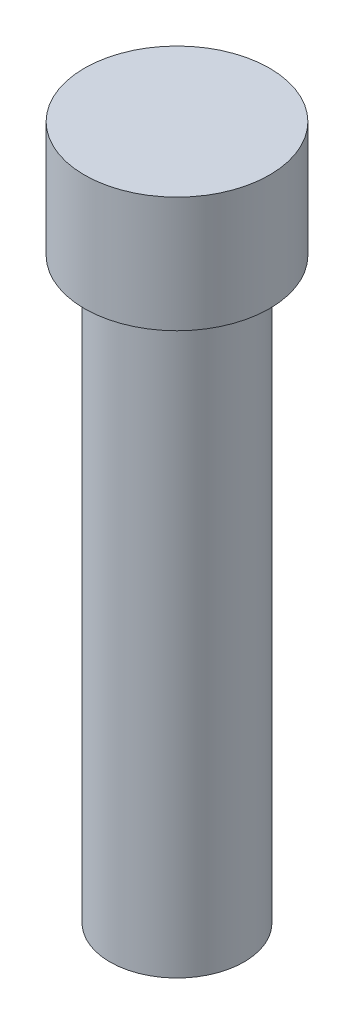
ISO-10303-21;
HEADER;
FILE_DESCRIPTION(('STEP AP214'),'2;1');
FILE_NAME('part.step','',(''),(''),'','','');
FILE_SCHEMA(('AUTOMOTIVE_DESIGN { 1 0 10303 214 1 1 1 1 }'));
ENDSEC;
DATA;
#1=APPLICATION_CONTEXT('core data for automotive mechanical design processes');
#2=APPLICATION_PROTOCOL_DEFINITION('international standard','automotive_design',2000,#1);
#3=PRODUCT_CONTEXT('',#1,'mechanical');
#4=PRODUCT('Part','Part','',(#3));
#5=PRODUCT_RELATED_PRODUCT_CATEGORY('part','',(#4));
#6=PRODUCT_DEFINITION_FORMATION('','',#4);
#7=PRODUCT_DEFINITION_CONTEXT('part definition',#1,'design');
#8=PRODUCT_DEFINITION('design','',#6,#7);
#9=PRODUCT_DEFINITION_SHAPE('','',#8);
#10=(LENGTH_UNIT() NAMED_UNIT(*) SI_UNIT(.MILLI.,.METRE.));
#11=(NAMED_UNIT(*) PLANE_ANGLE_UNIT() SI_UNIT($,.RADIAN.));
#12=(NAMED_UNIT(*) SI_UNIT($,.STERADIAN.) SOLID_ANGLE_UNIT());
#13=UNCERTAINTY_MEASURE_WITH_UNIT(LENGTH_MEASURE(1.E-05),#10,'distance_accuracy_value','');
#14=(GEOMETRIC_REPRESENTATION_CONTEXT(3) GLOBAL_UNCERTAINTY_ASSIGNED_CONTEXT((#13)) GLOBAL_UNIT_ASSIGNED_CONTEXT((#10,
#11,#12)) REPRESENTATION_CONTEXT('',''));
#15=CARTESIAN_POINT('',(0.,0.,0.));
#16=DIRECTION('',(0.,0.,1.));
#17=DIRECTION('',(1.,0.,0.));
#18=AXIS2_PLACEMENT_3D('',#15,#16,#17);
#19=CARTESIAN_POINT('',(0.,25.,0.));
#20=DIRECTION('',(0.,-1.,0.));
#21=DIRECTION('',(0.,0.,-1.));
#22=AXIS2_PLACEMENT_3D('',#19,#20,#21);
#23=CYLINDRICAL_SURFACE('',#22,2.9);
#24=CARTESIAN_POINT('',(0.,25.,0.));
#25=DIRECTION('',(0.,1.,0.));
#26=DIRECTION('',(0.,0.,1.));
#27=AXIS2_PLACEMENT_3D('',#24,#25,#26);
#28=CIRCLE('',#27,2.9);
#29=CARTESIAN_POINT('',(0.,25.,2.9));
#30=VERTEX_POINT('',#29);
#31=EDGE_CURVE('E10',#30,#30,#28,.T.);
#32=ORIENTED_EDGE('',*,*,#31,.F.);
#33=EDGE_LOOP('',(#32));
#34=FACE_BOUND('',#33,.T.);
#35=CARTESIAN_POINT('',(0.,0.,0.));
#36=DIRECTION('',(0.,1.,0.));
#37=DIRECTION('',(0.,0.,1.));
#38=AXIS2_PLACEMENT_3D('',#35,#36,#37);
#39=CIRCLE('',#38,2.9);
#40=CARTESIAN_POINT('',(0.,0.,2.9));
#41=VERTEX_POINT('',#40);
#42=EDGE_CURVE('E46',#41,#41,#39,.T.);
#43=ORIENTED_EDGE('',*,*,#42,.T.);
#44=EDGE_LOOP('',(#43));
#45=FACE_BOUND('',#44,.T.);
#46=ADVANCED_FACE('F43',(#34,#45),#23,.T.);
#47=CARTESIAN_POINT('',(0.,0.,0.));
#48=DIRECTION('',(0.,1.,0.));
#49=DIRECTION('',(0.,0.,1.));
#50=AXIS2_PLACEMENT_3D('',#47,#48,#49);
#51=PLANE('',#50);
#52=ORIENTED_EDGE('',*,*,#42,.F.);
#53=EDGE_LOOP('',(#52));
#54=FACE_BOUND('',#53,.T.);
#55=ADVANCED_FACE('F70',(#54),#51,.F.);
#56=CARTESIAN_POINT('',(0.,30.,0.));
#57=DIRECTION('',(0.,-1.,0.));
#58=DIRECTION('',(0.,0.,-1.));
#59=AXIS2_PLACEMENT_3D('',#56,#57,#58);
#60=CYLINDRICAL_SURFACE('',#59,4.);
#61=CARTESIAN_POINT('',(0.,30.,0.));
#62=DIRECTION('',(0.,1.,0.));
#63=DIRECTION('',(0.,0.,1.));
#64=AXIS2_PLACEMENT_3D('',#61,#62,#63);
#65=CIRCLE('',#64,4.);
#66=CARTESIAN_POINT('',(0.,30.,4.));
#67=VERTEX_POINT('',#66);
#68=EDGE_CURVE('E55',#67,#67,#65,.T.);
#69=ORIENTED_EDGE('',*,*,#68,.F.);
#70=EDGE_LOOP('',(#69));
#71=FACE_BOUND('',#70,.T.);
#72=CARTESIAN_POINT('',(0.,25.,0.));
#73=DIRECTION('',(0.,1.,0.));
#74=DIRECTION('',(0.,0.,1.));
#75=AXIS2_PLACEMENT_3D('',#72,#73,#74);
#76=CIRCLE('',#75,4.);
#77=CARTESIAN_POINT('',(0.,25.,4.));
#78=VERTEX_POINT('',#77);
#79=EDGE_CURVE('E57',#78,#78,#76,.T.);
#80=ORIENTED_EDGE('',*,*,#79,.T.);
#81=EDGE_LOOP('',(#80));
#82=FACE_BOUND('',#81,.T.);
#83=ADVANCED_FACE('F67',(#71,#82),#60,.T.);
#84=CARTESIAN_POINT('',(0.,30.,0.));
#85=DIRECTION('',(0.,1.,0.));
#86=DIRECTION('',(0.,0.,1.));
#87=AXIS2_PLACEMENT_3D('',#84,#85,#86);
#88=PLANE('',#87);
#89=ORIENTED_EDGE('',*,*,#68,.T.);
#90=EDGE_LOOP('',(#89));
#91=FACE_BOUND('',#90,.T.);
#92=ADVANCED_FACE('F65',(#91),#88,.T.);
#93=CARTESIAN_POINT('',(0.,25.,0.));
#94=DIRECTION('',(0.,1.,0.));
#95=DIRECTION('',(0.,0.,1.));
#96=AXIS2_PLACEMENT_3D('',#93,#94,#95);
#97=PLANE('',#96);
#98=ORIENTED_EDGE('',*,*,#31,.T.);
#99=EDGE_LOOP('',(#98));
#100=FACE_BOUND('',#99,.T.);
#101=ORIENTED_EDGE('',*,*,#79,.F.);
#102=EDGE_LOOP('',(#101));
#103=FACE_BOUND('',#102,.T.);
#104=ADVANCED_FACE('F74',(#100,#103),#97,.F.);
#105=CLOSED_SHELL('',(#46,#55,#83,#92,#104));
#106=MANIFOLD_SOLID_BREP('B2',#105);
#107=ADVANCED_BREP_SHAPE_REPRESENTATION('',(#18,#106),#14);
#108=SHAPE_DEFINITION_REPRESENTATION(#9,#107);
ENDSEC;
END-ISO-10303-21;
